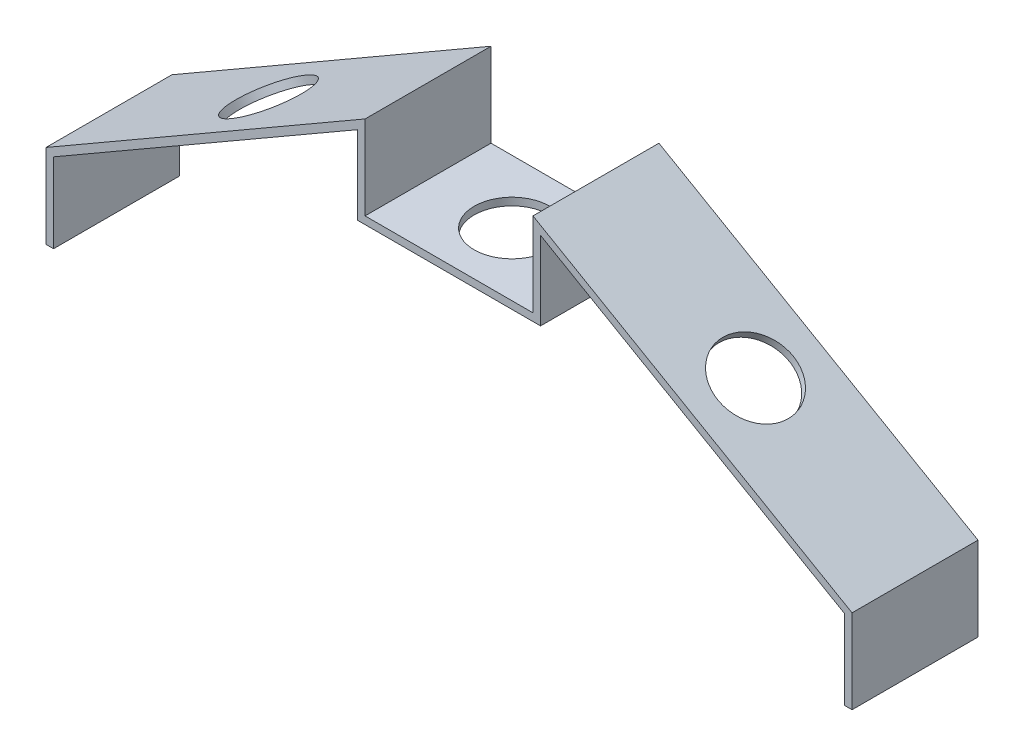
ISO-10303-21;
HEADER;
FILE_DESCRIPTION(('STEP AP214'),'2;1');
FILE_NAME('part.step','',(''),(''),'','','');
FILE_SCHEMA(('AUTOMOTIVE_DESIGN { 1 0 10303 214 1 1 1 1 }'));
ENDSEC;
DATA;
#1=APPLICATION_CONTEXT('core data for automotive mechanical design processes');
#2=APPLICATION_PROTOCOL_DEFINITION('international standard','automotive_design',2000,#1);
#3=PRODUCT_CONTEXT('',#1,'mechanical');
#4=PRODUCT('Part','Part','',(#3));
#5=PRODUCT_RELATED_PRODUCT_CATEGORY('part','',(#4));
#6=PRODUCT_DEFINITION_FORMATION('','',#4);
#7=PRODUCT_DEFINITION_CONTEXT('part definition',#1,'design');
#8=PRODUCT_DEFINITION('design','',#6,#7);
#9=PRODUCT_DEFINITION_SHAPE('','',#8);
#10=(LENGTH_UNIT() NAMED_UNIT(*) SI_UNIT(.MILLI.,.METRE.));
#11=(NAMED_UNIT(*) PLANE_ANGLE_UNIT() SI_UNIT($,.RADIAN.));
#12=(NAMED_UNIT(*) SI_UNIT($,.STERADIAN.) SOLID_ANGLE_UNIT());
#13=UNCERTAINTY_MEASURE_WITH_UNIT(LENGTH_MEASURE(1.E-05),#10,'distance_accuracy_value','');
#14=(GEOMETRIC_REPRESENTATION_CONTEXT(3) GLOBAL_UNCERTAINTY_ASSIGNED_CONTEXT((#13)) GLOBAL_UNIT_ASSIGNED_CONTEXT((#10,
#11,#12)) REPRESENTATION_CONTEXT('',''));
#15=CARTESIAN_POINT('',(0.,0.,0.));
#16=DIRECTION('',(0.,0.,1.));
#17=DIRECTION('',(1.,0.,0.));
#18=AXIS2_PLACEMENT_3D('',#15,#16,#17);
#19=CARTESIAN_POINT('',(-20.,0.,30.));
#20=DIRECTION('',(-1.,0.,0.));
#21=DIRECTION('',(0.,-1.,0.));
#22=AXIS2_PLACEMENT_3D('',#19,#20,#21);
#23=PLANE('',#22);
#24=DIRECTION('',(0.,1.,0.));
#25=VECTOR('',#24,1.);
#26=CARTESIAN_POINT('',(-20.,0.,0.));
#27=LINE('',#26,#25);
#28=CARTESIAN_POINT('',(-20.,0.,0.));
#29=VERTEX_POINT('',#28);
#30=CARTESIAN_POINT('',(-20.,20.,0.));
#31=VERTEX_POINT('',#30);
#32=EDGE_CURVE('E189',#29,#31,#27,.T.);
#33=ORIENTED_EDGE('',*,*,#32,.T.);
#34=DIRECTION('',(0.,0.,-1.));
#35=VECTOR('',#34,1.);
#36=CARTESIAN_POINT('',(-20.,20.,30.));
#37=LINE('',#36,#35);
#38=CARTESIAN_POINT('',(-20.,20.,30.));
#39=VERTEX_POINT('',#38);
#40=EDGE_CURVE('E11',#39,#31,#37,.T.);
#41=ORIENTED_EDGE('',*,*,#40,.F.);
#42=DIRECTION('',(0.,1.,0.));
#43=VECTOR('',#42,1.);
#44=CARTESIAN_POINT('',(-20.,0.,30.));
#45=LINE('',#44,#43);
#46=CARTESIAN_POINT('',(-20.,0.,30.));
#47=VERTEX_POINT('',#46);
#48=EDGE_CURVE('E236',#47,#39,#45,.T.);
#49=ORIENTED_EDGE('',*,*,#48,.F.);
#50=DIRECTION('',(0.,0.,-1.));
#51=VECTOR('',#50,1.);
#52=CARTESIAN_POINT('',(-20.,0.,30.));
#53=LINE('',#52,#51);
#54=EDGE_CURVE('E185',#47,#29,#53,.T.);
#55=ORIENTED_EDGE('',*,*,#54,.T.);
#56=EDGE_LOOP('',(#33,#41,#49,#55));
#57=FACE_BOUND('',#56,.T.);
#58=ADVANCED_FACE('F39',(#57),#23,.F.);
#59=CARTESIAN_POINT('',(-20.,20.,30.));
#60=DIRECTION('',(0.500000000000001,-0.866025403784438,0.));
#61=DIRECTION('',(0.866025403784438,0.500000000000001,0.));
#62=AXIS2_PLACEMENT_3D('',#59,#60,#61);
#63=PLANE('',#62);
#64=CARTESIAN_POINT('',(-58.,-1.93931022920584,15.));
#65=DIRECTION('',(-0.500000000000002,0.866025403784438,0.));
#66=DIRECTION('',(-0.866025403784438,-0.500000000000002,0.));
#67=AXIS2_PLACEMENT_3D('',#64,#65,#66);
#68=CIRCLE('',#67,9.);
#69=CARTESIAN_POINT('',(-65.7942286340599,-6.43931022920586,15.));
#70=VERTEX_POINT('',#69);
#71=EDGE_CURVE('E421',#70,#70,#68,.T.);
#72=ORIENTED_EDGE('',*,*,#71,.F.);
#73=EDGE_LOOP('',(#72));
#74=FACE_BOUND('',#73,.T.);
#75=DIRECTION('',(-0.866025403784438,-0.500000000000001,0.));
#76=VECTOR('',#75,1.);
#77=CARTESIAN_POINT('',(-20.,20.,0.));
#78=LINE('',#77,#76);
#79=CARTESIAN_POINT('',(-96.,-23.8786204584117,0.));
#80=VERTEX_POINT('',#79);
#81=EDGE_CURVE('E193',#31,#80,#78,.T.);
#82=ORIENTED_EDGE('',*,*,#81,.T.);
#83=DIRECTION('',(0.,0.,-1.));
#84=VECTOR('',#83,1.);
#85=CARTESIAN_POINT('',(-96.,-23.8786204584117,30.));
#86=LINE('',#85,#84);
#87=CARTESIAN_POINT('',(-96.,-23.8786204584117,30.));
#88=VERTEX_POINT('',#87);
#89=EDGE_CURVE('E49',#88,#80,#86,.T.);
#90=ORIENTED_EDGE('',*,*,#89,.F.);
#91=DIRECTION('',(-0.866025403784438,-0.500000000000001,0.));
#92=VECTOR('',#91,1.);
#93=CARTESIAN_POINT('',(-20.,20.,30.));
#94=LINE('',#93,#92);
#95=EDGE_CURVE('E124',#39,#88,#94,.T.);
#96=ORIENTED_EDGE('',*,*,#95,.F.);
#97=ORIENTED_EDGE('',*,*,#40,.T.);
#98=EDGE_LOOP('',(#82,#90,#96,#97));
#99=FACE_BOUND('',#98,.T.);
#100=ADVANCED_FACE('F361',(#74,#99),#63,.F.);
#101=CARTESIAN_POINT('',(-96.,-23.8786204584117,30.));
#102=DIRECTION('',(1.,0.,0.));
#103=DIRECTION('',(0.,0.,-1.));
#104=AXIS2_PLACEMENT_3D('',#101,#102,#103);
#105=PLANE('',#104);
#106=DIRECTION('',(0.,-1.,0.));
#107=VECTOR('',#106,1.);
#108=CARTESIAN_POINT('',(-96.,-23.8786204584117,0.));
#109=LINE('',#108,#107);
#110=CARTESIAN_POINT('',(-96.,-43.8786204584117,0.));
#111=VERTEX_POINT('',#110);
#112=EDGE_CURVE('E197',#80,#111,#109,.T.);
#113=ORIENTED_EDGE('',*,*,#112,.T.);
#114=DIRECTION('',(0.,0.,-1.));
#115=VECTOR('',#114,1.);
#116=CARTESIAN_POINT('',(-96.,-43.8786204584117,30.));
#117=LINE('',#116,#115);
#118=CARTESIAN_POINT('',(-96.,-43.8786204584117,30.));
#119=VERTEX_POINT('',#118);
#120=EDGE_CURVE('E279',#119,#111,#117,.T.);
#121=ORIENTED_EDGE('',*,*,#120,.F.);
#122=DIRECTION('',(0.,-1.,0.));
#123=VECTOR('',#122,1.);
#124=CARTESIAN_POINT('',(-96.,-23.8786204584117,30.));
#125=LINE('',#124,#123);
#126=EDGE_CURVE('E290',#88,#119,#125,.T.);
#127=ORIENTED_EDGE('',*,*,#126,.F.);
#128=ORIENTED_EDGE('',*,*,#89,.T.);
#129=EDGE_LOOP('',(#113,#121,#127,#128));
#130=FACE_BOUND('',#129,.T.);
#131=ADVANCED_FACE('F288',(#130),#105,.F.);
#132=CARTESIAN_POINT('',(-94.2,-43.8786204584117,30.));
#133=DIRECTION('',(0.,1.,0.));
#134=DIRECTION('',(0.,0.,1.));
#135=AXIS2_PLACEMENT_3D('',#132,#133,#134);
#136=PLANE('',#135);
#137=DIRECTION('',(1.,0.,0.));
#138=VECTOR('',#137,1.);
#139=CARTESIAN_POINT('',(-94.2,-43.8786204584117,0.));
#140=LINE('',#139,#138);
#141=CARTESIAN_POINT('',(-94.2,-43.8786204584117,0.));
#142=VERTEX_POINT('',#141);
#143=EDGE_CURVE('E200',#111,#142,#140,.T.);
#144=ORIENTED_EDGE('',*,*,#143,.T.);
#145=DIRECTION('',(0.,0.,-1.));
#146=VECTOR('',#145,1.);
#147=CARTESIAN_POINT('',(-94.2,-43.8786204584117,30.));
#148=LINE('',#147,#146);
#149=CARTESIAN_POINT('',(-94.2,-43.8786204584117,30.));
#150=VERTEX_POINT('',#149);
#151=EDGE_CURVE('E275',#150,#142,#148,.T.);
#152=ORIENTED_EDGE('',*,*,#151,.F.);
#153=DIRECTION('',(1.,0.,0.));
#154=VECTOR('',#153,1.);
#155=CARTESIAN_POINT('',(-94.2,-43.8786204584117,30.));
#156=LINE('',#155,#154);
#157=EDGE_CURVE('E309',#119,#150,#156,.T.);
#158=ORIENTED_EDGE('',*,*,#157,.F.);
#159=ORIENTED_EDGE('',*,*,#120,.T.);
#160=EDGE_LOOP('',(#144,#152,#158,#159));
#161=FACE_BOUND('',#160,.T.);
#162=ADVANCED_FACE('F299',(#161),#136,.F.);
#163=CARTESIAN_POINT('',(-94.2,-24.9178509429529,30.));
#164=DIRECTION('',(-1.,0.,0.));
#165=DIRECTION('',(0.,0.,1.));
#166=AXIS2_PLACEMENT_3D('',#163,#164,#165);
#167=PLANE('',#166);
#168=DIRECTION('',(0.,1.,0.));
#169=VECTOR('',#168,1.);
#170=CARTESIAN_POINT('',(-94.2,-24.9178509429529,0.));
#171=LINE('',#170,#169);
#172=CARTESIAN_POINT('',(-94.2,-24.9178509429529,0.));
#173=VERTEX_POINT('',#172);
#174=EDGE_CURVE('E203',#142,#173,#171,.T.);
#175=ORIENTED_EDGE('',*,*,#174,.T.);
#176=DIRECTION('',(0.,0.,-1.));
#177=VECTOR('',#176,1.);
#178=CARTESIAN_POINT('',(-94.2,-24.9178509429529,30.));
#179=LINE('',#178,#177);
#180=CARTESIAN_POINT('',(-94.2,-24.9178509429529,30.));
#181=VERTEX_POINT('',#180);
#182=EDGE_CURVE('E271',#181,#173,#179,.T.);
#183=ORIENTED_EDGE('',*,*,#182,.F.);
#184=DIRECTION('',(0.,1.,0.));
#185=VECTOR('',#184,1.);
#186=CARTESIAN_POINT('',(-94.2,-24.9178509429529,30.));
#187=LINE('',#186,#185);
#188=EDGE_CURVE('E305',#150,#181,#187,.T.);
#189=ORIENTED_EDGE('',*,*,#188,.F.);
#190=ORIENTED_EDGE('',*,*,#151,.T.);
#191=EDGE_LOOP('',(#175,#183,#189,#190));
#192=FACE_BOUND('',#191,.T.);
#193=ADVANCED_FACE('F303',(#192),#167,.F.);
#194=CARTESIAN_POINT('',(-21.8,16.882308546376,30.));
#195=DIRECTION('',(-0.5,0.866025403784439,0.));
#196=DIRECTION('',(-0.866025403784439,-0.5,0.));
#197=AXIS2_PLACEMENT_3D('',#194,#195,#196);
#198=PLANE('',#197);
#199=CARTESIAN_POINT('',(-57.1,-3.49815595601778,15.));
#200=DIRECTION('',(-0.5,0.866025403784439,0.));
#201=DIRECTION('',(-0.866025403784439,-0.5,0.));
#202=AXIS2_PLACEMENT_3D('',#199,#200,#201);
#203=CIRCLE('',#202,9.);
#204=CARTESIAN_POINT('',(-64.89422863406,-7.99815595601778,15.));
#205=VERTEX_POINT('',#204);
#206=EDGE_CURVE('E42',#205,#205,#203,.T.);
#207=ORIENTED_EDGE('',*,*,#206,.T.);
#208=EDGE_LOOP('',(#207));
#209=FACE_BOUND('',#208,.T.);
#210=DIRECTION('',(0.866025403784439,0.5,0.));
#211=VECTOR('',#210,1.);
#212=CARTESIAN_POINT('',(-21.8,16.882308546376,0.));
#213=LINE('',#212,#211);
#214=CARTESIAN_POINT('',(-21.8,16.882308546376,0.));
#215=VERTEX_POINT('',#214);
#216=EDGE_CURVE('E206',#173,#215,#213,.T.);
#217=ORIENTED_EDGE('',*,*,#216,.T.);
#218=DIRECTION('',(0.,0.,-1.));
#219=VECTOR('',#218,1.);
#220=CARTESIAN_POINT('',(-21.8,16.882308546376,30.));
#221=LINE('',#220,#219);
#222=CARTESIAN_POINT('',(-21.8,16.882308546376,30.));
#223=VERTEX_POINT('',#222);
#224=EDGE_CURVE('E267',#223,#215,#221,.T.);
#225=ORIENTED_EDGE('',*,*,#224,.F.);
#226=DIRECTION('',(0.866025403784439,0.5,0.));
#227=VECTOR('',#226,1.);
#228=CARTESIAN_POINT('',(-21.8,16.882308546376,30.));
#229=LINE('',#228,#227);
#230=EDGE_CURVE('E308',#181,#223,#229,.T.);
#231=ORIENTED_EDGE('',*,*,#230,.F.);
#232=ORIENTED_EDGE('',*,*,#182,.T.);
#233=EDGE_LOOP('',(#217,#225,#231,#232));
#234=FACE_BOUND('',#233,.T.);
#235=ADVANCED_FACE('F376',(#209,#234),#198,.F.);
#236=CARTESIAN_POINT('',(-21.8,-1.8,30.));
#237=DIRECTION('',(1.,0.,0.));
#238=DIRECTION('',(0.,0.,-1.));
#239=AXIS2_PLACEMENT_3D('',#236,#237,#238);
#240=PLANE('',#239);
#241=DIRECTION('',(0.,-1.,0.));
#242=VECTOR('',#241,1.);
#243=CARTESIAN_POINT('',(-21.8,-1.8,0.));
#244=LINE('',#243,#242);
#245=CARTESIAN_POINT('',(-21.8,-1.8,0.));
#246=VERTEX_POINT('',#245);
#247=EDGE_CURVE('E209',#215,#246,#244,.T.);
#248=ORIENTED_EDGE('',*,*,#247,.T.);
#249=DIRECTION('',(0.,0.,-1.));
#250=VECTOR('',#249,1.);
#251=CARTESIAN_POINT('',(-21.8,-1.8,30.));
#252=LINE('',#251,#250);
#253=CARTESIAN_POINT('',(-21.8,-1.8,30.));
#254=VERTEX_POINT('',#253);
#255=EDGE_CURVE('E263',#254,#246,#252,.T.);
#256=ORIENTED_EDGE('',*,*,#255,.F.);
#257=DIRECTION('',(0.,-1.,0.));
#258=VECTOR('',#257,1.);
#259=CARTESIAN_POINT('',(-21.8,-1.8,30.));
#260=LINE('',#259,#258);
#261=EDGE_CURVE('E313',#223,#254,#260,.T.);
#262=ORIENTED_EDGE('',*,*,#261,.F.);
#263=ORIENTED_EDGE('',*,*,#224,.T.);
#264=EDGE_LOOP('',(#248,#256,#262,#263));
#265=FACE_BOUND('',#264,.T.);
#266=ADVANCED_FACE('F379',(#265),#240,.F.);
#267=CARTESIAN_POINT('',(-21.8,-1.8,30.));
#268=DIRECTION('',(0.,1.,0.));
#269=DIRECTION('',(0.,0.,1.));
#270=AXIS2_PLACEMENT_3D('',#267,#268,#269);
#271=PLANE('',#270);
#272=CARTESIAN_POINT('',(0.,-1.8,15.));
#273=DIRECTION('',(0.,1.,0.));
#274=DIRECTION('',(0.,0.,1.));
#275=AXIS2_PLACEMENT_3D('',#272,#273,#274);
#276=CIRCLE('',#275,9.);
#277=CARTESIAN_POINT('',(0.,-1.8,24.));
#278=VERTEX_POINT('',#277);
#279=EDGE_CURVE('E194',#278,#278,#276,.T.);
#280=ORIENTED_EDGE('',*,*,#279,.T.);
#281=EDGE_LOOP('',(#280));
#282=FACE_BOUND('',#281,.T.);
#283=DIRECTION('',(1.,0.,0.));
#284=VECTOR('',#283,1.);
#285=CARTESIAN_POINT('',(-21.8,-1.8,0.));
#286=LINE('',#285,#284);
#287=CARTESIAN_POINT('',(21.8,-1.8,0.));
#288=VERTEX_POINT('',#287);
#289=EDGE_CURVE('E212',#246,#288,#286,.T.);
#290=ORIENTED_EDGE('',*,*,#289,.T.);
#291=DIRECTION('',(0.,0.,-1.));
#292=VECTOR('',#291,1.);
#293=CARTESIAN_POINT('',(21.8,-1.8,30.));
#294=LINE('',#293,#292);
#295=CARTESIAN_POINT('',(21.8,-1.8,30.));
#296=VERTEX_POINT('',#295);
#297=EDGE_CURVE('E259',#296,#288,#294,.T.);
#298=ORIENTED_EDGE('',*,*,#297,.F.);
#299=DIRECTION('',(1.,0.,0.));
#300=VECTOR('',#299,1.);
#301=CARTESIAN_POINT('',(-21.8,-1.8,30.));
#302=LINE('',#301,#300);
#303=EDGE_CURVE('E320',#254,#296,#302,.T.);
#304=ORIENTED_EDGE('',*,*,#303,.F.);
#305=ORIENTED_EDGE('',*,*,#255,.T.);
#306=EDGE_LOOP('',(#290,#298,#304,#305));
#307=FACE_BOUND('',#306,.T.);
#308=ADVANCED_FACE('F383',(#282,#307),#271,.F.);
#309=CARTESIAN_POINT('',(21.8,-1.8,30.));
#310=DIRECTION('',(-1.,0.,0.));
#311=DIRECTION('',(0.,0.,1.));
#312=AXIS2_PLACEMENT_3D('',#309,#310,#311);
#313=PLANE('',#312);
#314=DIRECTION('',(0.,1.,0.));
#315=VECTOR('',#314,1.);
#316=CARTESIAN_POINT('',(21.8,-1.8,0.));
#317=LINE('',#316,#315);
#318=CARTESIAN_POINT('',(21.8,16.882308546376,0.));
#319=VERTEX_POINT('',#318);
#320=EDGE_CURVE('E215',#288,#319,#317,.T.);
#321=ORIENTED_EDGE('',*,*,#320,.T.);
#322=DIRECTION('',(0.,0.,-1.));
#323=VECTOR('',#322,1.);
#324=CARTESIAN_POINT('',(21.8,16.882308546376,30.));
#325=LINE('',#324,#323);
#326=CARTESIAN_POINT('',(21.8,16.882308546376,30.));
#327=VERTEX_POINT('',#326);
#328=EDGE_CURVE('E255',#327,#319,#325,.T.);
#329=ORIENTED_EDGE('',*,*,#328,.F.);
#330=DIRECTION('',(0.,1.,0.));
#331=VECTOR('',#330,1.);
#332=CARTESIAN_POINT('',(21.8,-1.8,30.));
#333=LINE('',#332,#331);
#334=EDGE_CURVE('E323',#296,#327,#333,.T.);
#335=ORIENTED_EDGE('',*,*,#334,.F.);
#336=ORIENTED_EDGE('',*,*,#297,.T.);
#337=EDGE_LOOP('',(#321,#329,#335,#336));
#338=FACE_BOUND('',#337,.T.);
#339=ADVANCED_FACE('F387',(#338),#313,.F.);
#340=CARTESIAN_POINT('',(21.8,16.882308546376,30.));
#341=DIRECTION('',(0.5,0.866025403784439,0.));
#342=DIRECTION('',(-0.866025403784439,0.5,0.));
#343=AXIS2_PLACEMENT_3D('',#340,#341,#342);
#344=PLANE('',#343);
#345=CARTESIAN_POINT('',(57.1,-3.49815595601776,15.));
#346=DIRECTION('',(0.5,0.866025403784439,0.));
#347=DIRECTION('',(-0.866025403784439,0.5,0.));
#348=AXIS2_PLACEMENT_3D('',#345,#346,#347);
#349=CIRCLE('',#348,9.00000000000001);
#350=CARTESIAN_POINT('',(49.3057713659401,1.00184404398224,15.));
#351=VERTEX_POINT('',#350);
#352=EDGE_CURVE('E413',#351,#351,#349,.T.);
#353=ORIENTED_EDGE('',*,*,#352,.T.);
#354=EDGE_LOOP('',(#353));
#355=FACE_BOUND('',#354,.T.);
#356=DIRECTION('',(0.866025403784439,-0.5,0.));
#357=VECTOR('',#356,1.);
#358=CARTESIAN_POINT('',(21.8,16.882308546376,0.));
#359=LINE('',#358,#357);
#360=CARTESIAN_POINT('',(94.2,-24.9178509429529,0.));
#361=VERTEX_POINT('',#360);
#362=EDGE_CURVE('E218',#319,#361,#359,.T.);
#363=ORIENTED_EDGE('',*,*,#362,.T.);
#364=DIRECTION('',(0.,0.,-1.));
#365=VECTOR('',#364,1.);
#366=CARTESIAN_POINT('',(94.2,-24.9178509429529,30.));
#367=LINE('',#366,#365);
#368=CARTESIAN_POINT('',(94.2,-24.9178509429529,30.));
#369=VERTEX_POINT('',#368);
#370=EDGE_CURVE('E251',#369,#361,#367,.T.);
#371=ORIENTED_EDGE('',*,*,#370,.F.);
#372=DIRECTION('',(0.866025403784439,-0.5,0.));
#373=VECTOR('',#372,1.);
#374=CARTESIAN_POINT('',(21.8,16.882308546376,30.));
#375=LINE('',#374,#373);
#376=EDGE_CURVE('E326',#327,#369,#375,.T.);
#377=ORIENTED_EDGE('',*,*,#376,.F.);
#378=ORIENTED_EDGE('',*,*,#328,.T.);
#379=EDGE_LOOP('',(#363,#371,#377,#378));
#380=FACE_BOUND('',#379,.T.);
#381=ADVANCED_FACE('F391',(#355,#380),#344,.F.);
#382=CARTESIAN_POINT('',(94.2,-24.9178509429529,30.));
#383=DIRECTION('',(1.,0.,0.));
#384=DIRECTION('',(0.,0.,-1.));
#385=AXIS2_PLACEMENT_3D('',#382,#383,#384);
#386=PLANE('',#385);
#387=DIRECTION('',(0.,-1.,0.));
#388=VECTOR('',#387,1.);
#389=CARTESIAN_POINT('',(94.2,-24.9178509429529,0.));
#390=LINE('',#389,#388);
#391=CARTESIAN_POINT('',(94.2,-43.8786204584117,0.));
#392=VERTEX_POINT('',#391);
#393=EDGE_CURVE('E221',#361,#392,#390,.T.);
#394=ORIENTED_EDGE('',*,*,#393,.T.);
#395=DIRECTION('',(0.,0.,-1.));
#396=VECTOR('',#395,1.);
#397=CARTESIAN_POINT('',(94.2,-43.8786204584117,30.));
#398=LINE('',#397,#396);
#399=CARTESIAN_POINT('',(94.2,-43.8786204584117,30.));
#400=VERTEX_POINT('',#399);
#401=EDGE_CURVE('E247',#400,#392,#398,.T.);
#402=ORIENTED_EDGE('',*,*,#401,.F.);
#403=DIRECTION('',(0.,-1.,0.));
#404=VECTOR('',#403,1.);
#405=CARTESIAN_POINT('',(94.2,-24.9178509429529,30.));
#406=LINE('',#405,#404);
#407=EDGE_CURVE('E329',#369,#400,#406,.T.);
#408=ORIENTED_EDGE('',*,*,#407,.F.);
#409=ORIENTED_EDGE('',*,*,#370,.T.);
#410=EDGE_LOOP('',(#394,#402,#408,#409));
#411=FACE_BOUND('',#410,.T.);
#412=ADVANCED_FACE('F395',(#411),#386,.F.);
#413=CARTESIAN_POINT('',(94.2,-43.8786204584117,30.));
#414=DIRECTION('',(0.,1.,0.));
#415=DIRECTION('',(0.,0.,1.));
#416=AXIS2_PLACEMENT_3D('',#413,#414,#415);
#417=PLANE('',#416);
#418=DIRECTION('',(1.,0.,0.));
#419=VECTOR('',#418,1.);
#420=CARTESIAN_POINT('',(94.2,-43.8786204584117,0.));
#421=LINE('',#420,#419);
#422=CARTESIAN_POINT('',(96.,-43.8786204584117,0.));
#423=VERTEX_POINT('',#422);
#424=EDGE_CURVE('E224',#392,#423,#421,.T.);
#425=ORIENTED_EDGE('',*,*,#424,.T.);
#426=DIRECTION('',(0.,0.,-1.));
#427=VECTOR('',#426,1.);
#428=CARTESIAN_POINT('',(96.,-43.8786204584117,30.));
#429=LINE('',#428,#427);
#430=CARTESIAN_POINT('',(96.,-43.8786204584117,30.));
#431=VERTEX_POINT('',#430);
#432=EDGE_CURVE('E243',#431,#423,#429,.T.);
#433=ORIENTED_EDGE('',*,*,#432,.F.);
#434=DIRECTION('',(1.,0.,0.));
#435=VECTOR('',#434,1.);
#436=CARTESIAN_POINT('',(94.2,-43.8786204584117,30.));
#437=LINE('',#436,#435);
#438=EDGE_CURVE('E332',#400,#431,#437,.T.);
#439=ORIENTED_EDGE('',*,*,#438,.F.);
#440=ORIENTED_EDGE('',*,*,#401,.T.);
#441=EDGE_LOOP('',(#425,#433,#439,#440));
#442=FACE_BOUND('',#441,.T.);
#443=ADVANCED_FACE('F340',(#442),#417,.F.);
#444=CARTESIAN_POINT('',(96.,-23.8786204584117,30.));
#445=DIRECTION('',(-1.,0.,0.));
#446=DIRECTION('',(0.,-1.,0.));
#447=AXIS2_PLACEMENT_3D('',#444,#445,#446);
#448=PLANE('',#447);
#449=DIRECTION('',(0.,1.,0.));
#450=VECTOR('',#449,1.);
#451=CARTESIAN_POINT('',(96.,-23.8786204584117,0.));
#452=LINE('',#451,#450);
#453=CARTESIAN_POINT('',(96.,-23.8786204584117,0.));
#454=VERTEX_POINT('',#453);
#455=EDGE_CURVE('E227',#423,#454,#452,.T.);
#456=ORIENTED_EDGE('',*,*,#455,.T.);
#457=DIRECTION('',(0.,0.,-1.));
#458=VECTOR('',#457,1.);
#459=CARTESIAN_POINT('',(96.,-23.8786204584117,30.));
#460=LINE('',#459,#458);
#461=CARTESIAN_POINT('',(96.,-23.8786204584117,30.));
#462=VERTEX_POINT('',#461);
#463=EDGE_CURVE('E178',#462,#454,#460,.T.);
#464=ORIENTED_EDGE('',*,*,#463,.F.);
#465=DIRECTION('',(0.,1.,0.));
#466=VECTOR('',#465,1.);
#467=CARTESIAN_POINT('',(96.,-23.8786204584117,30.));
#468=LINE('',#467,#466);
#469=EDGE_CURVE('E167',#431,#462,#468,.T.);
#470=ORIENTED_EDGE('',*,*,#469,.F.);
#471=ORIENTED_EDGE('',*,*,#432,.T.);
#472=EDGE_LOOP('',(#456,#464,#470,#471));
#473=FACE_BOUND('',#472,.T.);
#474=ADVANCED_FACE('F344',(#473),#448,.F.);
#475=CARTESIAN_POINT('',(20.,20.,30.));
#476=DIRECTION('',(-0.500000000000001,-0.866025403784438,0.));
#477=DIRECTION('',(0.866025403784438,-0.500000000000001,0.));
#478=AXIS2_PLACEMENT_3D('',#475,#476,#477);
#479=PLANE('',#478);
#480=CARTESIAN_POINT('',(58.,-1.93931022920582,15.));
#481=DIRECTION('',(0.500000000000001,0.866025403784438,0.));
#482=DIRECTION('',(-0.866025403784438,0.500000000000001,0.));
#483=AXIS2_PLACEMENT_3D('',#480,#481,#482);
#484=CIRCLE('',#483,9.00000000000001);
#485=CARTESIAN_POINT('',(50.20577136594,2.56068977079419,15.));
#486=VERTEX_POINT('',#485);
#487=EDGE_CURVE('E410',#486,#486,#484,.T.);
#488=ORIENTED_EDGE('',*,*,#487,.F.);
#489=EDGE_LOOP('',(#488));
#490=FACE_BOUND('',#489,.T.);
#491=DIRECTION('',(-0.866025403784438,0.500000000000001,0.));
#492=VECTOR('',#491,1.);
#493=CARTESIAN_POINT('',(20.,20.,0.));
#494=LINE('',#493,#492);
#495=CARTESIAN_POINT('',(20.,20.,0.));
#496=VERTEX_POINT('',#495);
#497=EDGE_CURVE('E176',#454,#496,#494,.T.);
#498=ORIENTED_EDGE('',*,*,#497,.T.);
#499=DIRECTION('',(0.,0.,-1.));
#500=VECTOR('',#499,1.);
#501=CARTESIAN_POINT('',(20.,20.,30.));
#502=LINE('',#501,#500);
#503=CARTESIAN_POINT('',(20.,20.,30.));
#504=VERTEX_POINT('',#503);
#505=EDGE_CURVE('E173',#504,#496,#502,.T.);
#506=ORIENTED_EDGE('',*,*,#505,.F.);
#507=DIRECTION('',(-0.866025403784438,0.500000000000001,0.));
#508=VECTOR('',#507,1.);
#509=CARTESIAN_POINT('',(20.,20.,30.));
#510=LINE('',#509,#508);
#511=EDGE_CURVE('E161',#462,#504,#510,.T.);
#512=ORIENTED_EDGE('',*,*,#511,.F.);
#513=ORIENTED_EDGE('',*,*,#463,.T.);
#514=EDGE_LOOP('',(#498,#506,#512,#513));
#515=FACE_BOUND('',#514,.T.);
#516=ADVANCED_FACE('F174',(#490,#515),#479,.F.);
#517=CARTESIAN_POINT('',(20.,0.,30.));
#518=DIRECTION('',(1.,0.,0.));
#519=DIRECTION('',(0.,0.,-1.));
#520=AXIS2_PLACEMENT_3D('',#517,#518,#519);
#521=PLANE('',#520);
#522=DIRECTION('',(0.,-1.,0.));
#523=VECTOR('',#522,1.);
#524=CARTESIAN_POINT('',(20.,0.,0.));
#525=LINE('',#524,#523);
#526=CARTESIAN_POINT('',(20.,0.,0.));
#527=VERTEX_POINT('',#526);
#528=EDGE_CURVE('E110',#496,#527,#525,.T.);
#529=ORIENTED_EDGE('',*,*,#528,.T.);
#530=DIRECTION('',(0.,0.,-1.));
#531=VECTOR('',#530,1.);
#532=CARTESIAN_POINT('',(20.,0.,30.));
#533=LINE('',#532,#531);
#534=CARTESIAN_POINT('',(20.,0.,30.));
#535=VERTEX_POINT('',#534);
#536=EDGE_CURVE('E179',#535,#527,#533,.T.);
#537=ORIENTED_EDGE('',*,*,#536,.F.);
#538=DIRECTION('',(0.,-1.,0.));
#539=VECTOR('',#538,1.);
#540=CARTESIAN_POINT('',(20.,0.,30.));
#541=LINE('',#540,#539);
#542=EDGE_CURVE('E165',#504,#535,#541,.T.);
#543=ORIENTED_EDGE('',*,*,#542,.F.);
#544=ORIENTED_EDGE('',*,*,#505,.T.);
#545=EDGE_LOOP('',(#529,#537,#543,#544));
#546=FACE_BOUND('',#545,.T.);
#547=ADVANCED_FACE('F181',(#546),#521,.F.);
#548=CARTESIAN_POINT('',(-20.,0.,30.));
#549=DIRECTION('',(0.,-1.,0.));
#550=DIRECTION('',(1.,0.,0.));
#551=AXIS2_PLACEMENT_3D('',#548,#549,#550);
#552=PLANE('',#551);
#553=CARTESIAN_POINT('',(0.,0.,15.));
#554=DIRECTION('',(0.,1.,0.));
#555=DIRECTION('',(-1.,0.,0.));
#556=AXIS2_PLACEMENT_3D('',#553,#554,#555);
#557=CIRCLE('',#556,9.);
#558=CARTESIAN_POINT('',(-9.,0.,15.));
#559=VERTEX_POINT('',#558);
#560=EDGE_CURVE('E418',#559,#559,#557,.T.);
#561=ORIENTED_EDGE('',*,*,#560,.F.);
#562=EDGE_LOOP('',(#561));
#563=FACE_BOUND('',#562,.T.);
#564=DIRECTION('',(-1.,0.,0.));
#565=VECTOR('',#564,1.);
#566=CARTESIAN_POINT('',(-20.,0.,0.));
#567=LINE('',#566,#565);
#568=EDGE_CURVE('E116',#527,#29,#567,.T.);
#569=ORIENTED_EDGE('',*,*,#568,.T.);
#570=ORIENTED_EDGE('',*,*,#54,.F.);
#571=DIRECTION('',(-1.,0.,0.));
#572=VECTOR('',#571,1.);
#573=CARTESIAN_POINT('',(-20.,0.,30.));
#574=LINE('',#573,#572);
#575=EDGE_CURVE('E57',#535,#47,#574,.T.);
#576=ORIENTED_EDGE('',*,*,#575,.F.);
#577=ORIENTED_EDGE('',*,*,#536,.T.);
#578=EDGE_LOOP('',(#569,#570,#576,#577));
#579=FACE_BOUND('',#578,.T.);
#580=ADVANCED_FACE('F348',(#563,#579),#552,.F.);
#581=CARTESIAN_POINT('',(0.,0.,30.));
#582=DIRECTION('',(0.,0.,1.));
#583=DIRECTION('',(1.,0.,0.));
#584=AXIS2_PLACEMENT_3D('',#581,#582,#583);
#585=PLANE('',#584);
#586=ORIENTED_EDGE('',*,*,#48,.T.);
#587=ORIENTED_EDGE('',*,*,#95,.T.);
#588=ORIENTED_EDGE('',*,*,#126,.T.);
#589=ORIENTED_EDGE('',*,*,#157,.T.);
#590=ORIENTED_EDGE('',*,*,#188,.T.);
#591=ORIENTED_EDGE('',*,*,#230,.T.);
#592=ORIENTED_EDGE('',*,*,#261,.T.);
#593=ORIENTED_EDGE('',*,*,#303,.T.);
#594=ORIENTED_EDGE('',*,*,#334,.T.);
#595=ORIENTED_EDGE('',*,*,#376,.T.);
#596=ORIENTED_EDGE('',*,*,#407,.T.);
#597=ORIENTED_EDGE('',*,*,#438,.T.);
#598=ORIENTED_EDGE('',*,*,#469,.T.);
#599=ORIENTED_EDGE('',*,*,#511,.T.);
#600=ORIENTED_EDGE('',*,*,#542,.T.);
#601=ORIENTED_EDGE('',*,*,#575,.T.);
#602=EDGE_LOOP('',(#586,#587,#588,#589,#590,#591,#592,#593,#594,#595,#596,#597,#598,#599,#600,#601));
#603=FACE_BOUND('',#602,.T.);
#604=ADVANCED_FACE('F163',(#603),#585,.T.);
#605=CARTESIAN_POINT('',(0.,0.,0.));
#606=DIRECTION('',(0.,0.,1.));
#607=DIRECTION('',(1.,0.,0.));
#608=AXIS2_PLACEMENT_3D('',#605,#606,#607);
#609=PLANE('',#608);
#610=ORIENTED_EDGE('',*,*,#32,.F.);
#611=ORIENTED_EDGE('',*,*,#568,.F.);
#612=ORIENTED_EDGE('',*,*,#528,.F.);
#613=ORIENTED_EDGE('',*,*,#497,.F.);
#614=ORIENTED_EDGE('',*,*,#455,.F.);
#615=ORIENTED_EDGE('',*,*,#424,.F.);
#616=ORIENTED_EDGE('',*,*,#393,.F.);
#617=ORIENTED_EDGE('',*,*,#362,.F.);
#618=ORIENTED_EDGE('',*,*,#320,.F.);
#619=ORIENTED_EDGE('',*,*,#289,.F.);
#620=ORIENTED_EDGE('',*,*,#247,.F.);
#621=ORIENTED_EDGE('',*,*,#216,.F.);
#622=ORIENTED_EDGE('',*,*,#174,.F.);
#623=ORIENTED_EDGE('',*,*,#143,.F.);
#624=ORIENTED_EDGE('',*,*,#112,.F.);
#625=ORIENTED_EDGE('',*,*,#81,.F.);
#626=EDGE_LOOP('',(#610,#611,#612,#613,#614,#615,#616,#617,#618,#619,#620,#621,#622,#623,#624,#625));
#627=FACE_BOUND('',#626,.T.);
#628=ADVANCED_FACE('F294',(#627),#609,.F.);
#629=CARTESIAN_POINT('',(0.,-43.8786204584117,15.));
#630=DIRECTION('',(0.,1.,0.));
#631=DIRECTION('',(-1.,0.,0.));
#632=AXIS2_PLACEMENT_3D('',#629,#630,#631);
#633=CYLINDRICAL_SURFACE('',#632,9.);
#634=ORIENTED_EDGE('',*,*,#560,.T.);
#635=EDGE_LOOP('',(#634));
#636=FACE_BOUND('',#635,.T.);
#637=ORIENTED_EDGE('',*,*,#279,.F.);
#638=EDGE_LOOP('',(#637));
#639=FACE_BOUND('',#638,.T.);
#640=ADVANCED_FACE('F437',(#636,#639),#633,.F.);
#641=CARTESIAN_POINT('',(43.,-27.920072342739,15.));
#642=DIRECTION('',(0.500000000000001,0.866025403784438,0.));
#643=DIRECTION('',(-0.866025403784438,0.500000000000001,0.));
#644=AXIS2_PLACEMENT_3D('',#641,#642,#643);
#645=CYLINDRICAL_SURFACE('',#644,9.00000000000001);
#646=ORIENTED_EDGE('',*,*,#487,.T.);
#647=EDGE_LOOP('',(#646));
#648=FACE_BOUND('',#647,.T.);
#649=ORIENTED_EDGE('',*,*,#352,.F.);
#650=EDGE_LOOP('',(#649));
#651=FACE_BOUND('',#650,.T.);
#652=ADVANCED_FACE('F439',(#648,#651),#645,.F.);
#653=CARTESIAN_POINT('',(-43.,-27.920072342739,15.));
#654=DIRECTION('',(-0.500000000000002,0.866025403784438,0.));
#655=DIRECTION('',(-0.866025403784438,-0.500000000000002,0.));
#656=AXIS2_PLACEMENT_3D('',#653,#654,#655);
#657=CYLINDRICAL_SURFACE('',#656,9.);
#658=ORIENTED_EDGE('',*,*,#71,.T.);
#659=EDGE_LOOP('',(#658));
#660=FACE_BOUND('',#659,.T.);
#661=ORIENTED_EDGE('',*,*,#206,.F.);
#662=EDGE_LOOP('',(#661));
#663=FACE_BOUND('',#662,.T.);
#664=ADVANCED_FACE('F446',(#660,#663),#657,.F.);
#665=CLOSED_SHELL('',(#58,#100,#131,#162,#193,#235,#266,#308,#339,#381,#412,#443,#474,#516,#547,
#580,#604,#628,#640,#652,#664));
#666=MANIFOLD_SOLID_BREP('B2',#665);
#667=ADVANCED_BREP_SHAPE_REPRESENTATION('',(#18,#666),#14);
#668=SHAPE_DEFINITION_REPRESENTATION(#9,#667);
ENDSEC;
END-ISO-10303-21;
